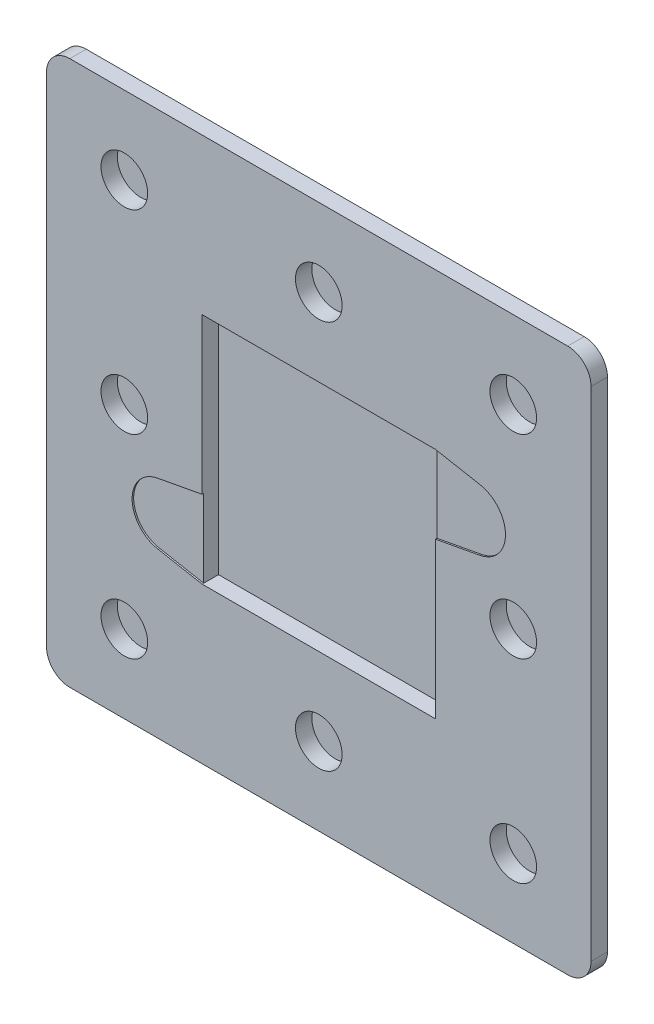
ISO-10303-21;
HEADER;
FILE_DESCRIPTION(('STEP AP214'),'2;1');
FILE_NAME('part.step','',(''),(''),'','','');
FILE_SCHEMA(('AUTOMOTIVE_DESIGN { 1 0 10303 214 1 1 1 1 }'));
ENDSEC;
DATA;
#1=APPLICATION_CONTEXT('core data for automotive mechanical design processes');
#2=APPLICATION_PROTOCOL_DEFINITION('international standard','automotive_design',2000,#1);
#3=PRODUCT_CONTEXT('',#1,'mechanical');
#4=PRODUCT('Part','Part','',(#3));
#5=PRODUCT_RELATED_PRODUCT_CATEGORY('part','',(#4));
#6=PRODUCT_DEFINITION_FORMATION('','',#4);
#7=PRODUCT_DEFINITION_CONTEXT('part definition',#1,'design');
#8=PRODUCT_DEFINITION('design','',#6,#7);
#9=PRODUCT_DEFINITION_SHAPE('','',#8);
#10=(LENGTH_UNIT() NAMED_UNIT(*) SI_UNIT(.MILLI.,.METRE.));
#11=(NAMED_UNIT(*) PLANE_ANGLE_UNIT() SI_UNIT($,.RADIAN.));
#12=(NAMED_UNIT(*) SI_UNIT($,.STERADIAN.) SOLID_ANGLE_UNIT());
#13=UNCERTAINTY_MEASURE_WITH_UNIT(LENGTH_MEASURE(1.E-05),#10,'distance_accuracy_value','');
#14=(GEOMETRIC_REPRESENTATION_CONTEXT(3) GLOBAL_UNCERTAINTY_ASSIGNED_CONTEXT((#13)) GLOBAL_UNIT_ASSIGNED_CONTEXT((#10,
#11,#12)) REPRESENTATION_CONTEXT('',''));
#15=CARTESIAN_POINT('',(0.,0.,0.));
#16=DIRECTION('',(0.,0.,1.));
#17=DIRECTION('',(1.,0.,0.));
#18=AXIS2_PLACEMENT_3D('',#15,#16,#17);
#19=CARTESIAN_POINT('',(35.,-35.,2.11));
#20=DIRECTION('',(-1.,0.,0.));
#21=DIRECTION('',(0.,0.,1.));
#22=AXIS2_PLACEMENT_3D('',#19,#20,#21);
#23=PLANE('',#22);
#24=DIRECTION('',(0.,1.,0.));
#25=VECTOR('',#24,1.);
#26=CARTESIAN_POINT('',(35.,-35.,0.));
#27=LINE('',#26,#25);
#28=CARTESIAN_POINT('',(35.,-32.,0.));
#29=VERTEX_POINT('',#28);
#30=CARTESIAN_POINT('',(35.,32.,0.));
#31=VERTEX_POINT('',#30);
#32=EDGE_CURVE('E305',#29,#31,#27,.T.);
#33=ORIENTED_EDGE('',*,*,#32,.T.);
#34=DIRECTION('',(0.,0.,-1.));
#35=VECTOR('',#34,1.);
#36=CARTESIAN_POINT('',(35.,32.,2.11));
#37=LINE('',#36,#35);
#38=CARTESIAN_POINT('',(35.,32.,2.11));
#39=VERTEX_POINT('',#38);
#40=EDGE_CURVE('E11',#31,#39,#37,.F.);
#41=ORIENTED_EDGE('',*,*,#40,.T.);
#42=DIRECTION('',(0.,1.,0.));
#43=VECTOR('',#42,1.);
#44=CARTESIAN_POINT('',(35.,-35.,2.11));
#45=LINE('',#44,#43);
#46=CARTESIAN_POINT('',(35.,-32.,2.11));
#47=VERTEX_POINT('',#46);
#48=EDGE_CURVE('E308',#47,#39,#45,.T.);
#49=ORIENTED_EDGE('',*,*,#48,.F.);
#50=DIRECTION('',(0.,0.,-1.));
#51=VECTOR('',#50,1.);
#52=CARTESIAN_POINT('',(35.,-32.,2.11));
#53=LINE('',#52,#51);
#54=EDGE_CURVE('E41',#47,#29,#53,.T.);
#55=ORIENTED_EDGE('',*,*,#54,.T.);
#56=EDGE_LOOP('',(#33,#41,#49,#55));
#57=FACE_BOUND('',#56,.T.);
#58=ADVANCED_FACE('F33',(#57),#23,.F.);
#59=CARTESIAN_POINT('',(-35.,35.,2.11));
#60=DIRECTION('',(0.,-1.,0.));
#61=DIRECTION('',(0.,0.,-1.));
#62=AXIS2_PLACEMENT_3D('',#59,#60,#61);
#63=PLANE('',#62);
#64=DIRECTION('',(-1.,0.,0.));
#65=VECTOR('',#64,1.);
#66=CARTESIAN_POINT('',(-35.,35.,0.));
#67=LINE('',#66,#65);
#68=CARTESIAN_POINT('',(32.,35.,0.));
#69=VERTEX_POINT('',#68);
#70=CARTESIAN_POINT('',(-32.,35.,0.));
#71=VERTEX_POINT('',#70);
#72=EDGE_CURVE('E322',#69,#71,#67,.T.);
#73=ORIENTED_EDGE('',*,*,#72,.T.);
#74=DIRECTION('',(0.,0.,-1.));
#75=VECTOR('',#74,1.);
#76=CARTESIAN_POINT('',(-32.,35.,2.11));
#77=LINE('',#76,#75);
#78=CARTESIAN_POINT('',(-32.,35.,2.11));
#79=VERTEX_POINT('',#78);
#80=EDGE_CURVE('E48',#71,#79,#77,.F.);
#81=ORIENTED_EDGE('',*,*,#80,.T.);
#82=DIRECTION('',(-1.,0.,0.));
#83=VECTOR('',#82,1.);
#84=CARTESIAN_POINT('',(-35.,35.,2.11));
#85=LINE('',#84,#83);
#86=CARTESIAN_POINT('',(32.,35.,2.11));
#87=VERTEX_POINT('',#86);
#88=EDGE_CURVE('E310',#87,#79,#85,.T.);
#89=ORIENTED_EDGE('',*,*,#88,.F.);
#90=DIRECTION('',(0.,0.,-1.));
#91=VECTOR('',#90,1.);
#92=CARTESIAN_POINT('',(32.,35.,2.11));
#93=LINE('',#92,#91);
#94=EDGE_CURVE('E353',#87,#69,#93,.T.);
#95=ORIENTED_EDGE('',*,*,#94,.T.);
#96=EDGE_LOOP('',(#73,#81,#89,#95));
#97=FACE_BOUND('',#96,.T.);
#98=ADVANCED_FACE('F371',(#97),#63,.F.);
#99=CARTESIAN_POINT('',(-35.,-35.,2.11));
#100=DIRECTION('',(1.,0.,0.));
#101=DIRECTION('',(0.,0.,-1.));
#102=AXIS2_PLACEMENT_3D('',#99,#100,#101);
#103=PLANE('',#102);
#104=DIRECTION('',(0.,-1.,0.));
#105=VECTOR('',#104,1.);
#106=CARTESIAN_POINT('',(-35.,-35.,0.));
#107=LINE('',#106,#105);
#108=CARTESIAN_POINT('',(-35.,32.,0.));
#109=VERTEX_POINT('',#108);
#110=CARTESIAN_POINT('',(-35.,-32.,0.));
#111=VERTEX_POINT('',#110);
#112=EDGE_CURVE('E324',#109,#111,#107,.T.);
#113=ORIENTED_EDGE('',*,*,#112,.T.);
#114=DIRECTION('',(0.,0.,-1.));
#115=VECTOR('',#114,1.);
#116=CARTESIAN_POINT('',(-35.,-32.,2.11));
#117=LINE('',#116,#115);
#118=CARTESIAN_POINT('',(-35.,-32.,2.11));
#119=VERTEX_POINT('',#118);
#120=EDGE_CURVE('E344',#111,#119,#117,.F.);
#121=ORIENTED_EDGE('',*,*,#120,.T.);
#122=DIRECTION('',(0.,-1.,0.));
#123=VECTOR('',#122,1.);
#124=CARTESIAN_POINT('',(-35.,-35.,2.11));
#125=LINE('',#124,#123);
#126=CARTESIAN_POINT('',(-35.,32.,2.11));
#127=VERTEX_POINT('',#126);
#128=EDGE_CURVE('E313',#127,#119,#125,.T.);
#129=ORIENTED_EDGE('',*,*,#128,.F.);
#130=DIRECTION('',(0.,0.,-1.));
#131=VECTOR('',#130,1.);
#132=CARTESIAN_POINT('',(-35.,32.,2.11));
#133=LINE('',#132,#131);
#134=EDGE_CURVE('E341',#127,#109,#133,.T.);
#135=ORIENTED_EDGE('',*,*,#134,.T.);
#136=EDGE_LOOP('',(#113,#121,#129,#135));
#137=FACE_BOUND('',#136,.T.);
#138=ADVANCED_FACE('F380',(#137),#103,.F.);
#139=CARTESIAN_POINT('',(-35.,-35.,2.11));
#140=DIRECTION('',(0.,1.,0.));
#141=DIRECTION('',(0.,0.,1.));
#142=AXIS2_PLACEMENT_3D('',#139,#140,#141);
#143=PLANE('',#142);
#144=DIRECTION('',(1.,0.,0.));
#145=VECTOR('',#144,1.);
#146=CARTESIAN_POINT('',(-35.,-35.,2.11));
#147=LINE('',#146,#145);
#148=CARTESIAN_POINT('',(-32.,-35.,2.11));
#149=VERTEX_POINT('',#148);
#150=CARTESIAN_POINT('',(32.,-35.,2.11));
#151=VERTEX_POINT('',#150);
#152=EDGE_CURVE('E316',#149,#151,#147,.T.);
#153=ORIENTED_EDGE('',*,*,#152,.F.);
#154=DIRECTION('',(0.,0.,-1.));
#155=VECTOR('',#154,1.);
#156=CARTESIAN_POINT('',(-32.,-35.,2.11));
#157=LINE('',#156,#155);
#158=CARTESIAN_POINT('',(-32.,-35.,0.));
#159=VERTEX_POINT('',#158);
#160=EDGE_CURVE('E330',#149,#159,#157,.T.);
#161=ORIENTED_EDGE('',*,*,#160,.T.);
#162=DIRECTION('',(1.,0.,0.));
#163=VECTOR('',#162,1.);
#164=CARTESIAN_POINT('',(-35.,-35.,0.));
#165=LINE('',#164,#163);
#166=CARTESIAN_POINT('',(32.,-35.,0.));
#167=VERTEX_POINT('',#166);
#168=EDGE_CURVE('E311',#159,#167,#165,.T.);
#169=ORIENTED_EDGE('',*,*,#168,.T.);
#170=DIRECTION('',(0.,0.,-1.));
#171=VECTOR('',#170,1.);
#172=CARTESIAN_POINT('',(32.,-35.,2.11));
#173=LINE('',#172,#171);
#174=EDGE_CURVE('E319',#167,#151,#173,.F.);
#175=ORIENTED_EDGE('',*,*,#174,.T.);
#176=EDGE_LOOP('',(#153,#161,#169,#175));
#177=FACE_BOUND('',#176,.T.);
#178=ADVANCED_FACE('F388',(#177),#143,.F.);
#179=CARTESIAN_POINT('',(0.,0.,2.11));
#180=DIRECTION('',(0.,0.,-1.));
#181=DIRECTION('',(-1.,0.,0.));
#182=AXIS2_PLACEMENT_3D('',#179,#180,#181);
#183=PLANE('',#182);
#184=CARTESIAN_POINT('',(25.,25.,2.11));
#185=DIRECTION('',(0.,0.,1.));
#186=DIRECTION('',(1.,0.,0.));
#187=AXIS2_PLACEMENT_3D('',#184,#185,#186);
#188=CIRCLE('',#187,3.);
#189=CARTESIAN_POINT('',(28.,25.,2.11));
#190=VERTEX_POINT('',#189);
#191=EDGE_CURVE('E282',#190,#190,#188,.T.);
#192=ORIENTED_EDGE('',*,*,#191,.F.);
#193=EDGE_LOOP('',(#192));
#194=FACE_BOUND('',#193,.T.);
#195=CARTESIAN_POINT('',(25.,0.,2.11));
#196=DIRECTION('',(0.,0.,1.));
#197=DIRECTION('',(1.,0.,0.));
#198=AXIS2_PLACEMENT_3D('',#195,#196,#197);
#199=CIRCLE('',#198,3.);
#200=CARTESIAN_POINT('',(28.,0.,2.11));
#201=VERTEX_POINT('',#200);
#202=EDGE_CURVE('E288',#201,#201,#199,.T.);
#203=ORIENTED_EDGE('',*,*,#202,.F.);
#204=EDGE_LOOP('',(#203));
#205=FACE_BOUND('',#204,.T.);
#206=CARTESIAN_POINT('',(25.,-25.,2.11));
#207=DIRECTION('',(0.,0.,1.));
#208=DIRECTION('',(1.,0.,0.));
#209=AXIS2_PLACEMENT_3D('',#206,#207,#208);
#210=CIRCLE('',#209,3.);
#211=CARTESIAN_POINT('',(28.,-25.,2.11));
#212=VERTEX_POINT('',#211);
#213=EDGE_CURVE('E294',#212,#212,#210,.T.);
#214=ORIENTED_EDGE('',*,*,#213,.F.);
#215=EDGE_LOOP('',(#214));
#216=FACE_BOUND('',#215,.T.);
#217=CARTESIAN_POINT('',(0.,-25.,2.11));
#218=DIRECTION('',(0.,0.,1.));
#219=DIRECTION('',(1.,0.,0.));
#220=AXIS2_PLACEMENT_3D('',#217,#218,#219);
#221=CIRCLE('',#220,3.);
#222=CARTESIAN_POINT('',(3.,-25.,2.11));
#223=VERTEX_POINT('',#222);
#224=EDGE_CURVE('E269',#223,#223,#221,.T.);
#225=ORIENTED_EDGE('',*,*,#224,.F.);
#226=EDGE_LOOP('',(#225));
#227=FACE_BOUND('',#226,.T.);
#228=DIRECTION('',(1.,0.,0.));
#229=VECTOR('',#228,1.);
#230=CARTESIAN_POINT('',(-15.,-15.,2.11));
#231=LINE('',#230,#229);
#232=CARTESIAN_POINT('',(-15.,-15.,2.11));
#233=VERTEX_POINT('',#232);
#234=CARTESIAN_POINT('',(15.,-15.,2.11));
#235=VERTEX_POINT('',#234);
#236=EDGE_CURVE('E239',#233,#235,#231,.T.);
#237=ORIENTED_EDGE('',*,*,#236,.F.);
#238=DIRECTION('',(0.98309518948453,-0.18309518948453,0.));
#239=VECTOR('',#238,1.);
#240=CARTESIAN_POINT('',(-15.,-15.,2.11));
#241=LINE('',#240,#239);
#242=CARTESIAN_POINT('',(-20.7323807579381,-13.9323807579381,2.11));
#243=VERTEX_POINT('',#242);
#244=EDGE_CURVE('E185',#243,#233,#241,.T.);
#245=ORIENTED_EDGE('',*,*,#244,.F.);
#246=CARTESIAN_POINT('',(-20.,-10.,2.11));
#247=DIRECTION('',(0.,0.,1.));
#248=DIRECTION('',(1.,0.,0.));
#249=AXIS2_PLACEMENT_3D('',#246,#247,#248);
#250=CIRCLE('',#249,4.);
#251=CARTESIAN_POINT('',(-20.7323807579381,-6.06761924206188,2.11));
#252=VERTEX_POINT('',#251);
#253=EDGE_CURVE('E784',#252,#243,#250,.T.);
#254=ORIENTED_EDGE('',*,*,#253,.F.);
#255=DIRECTION('',(-0.98309518948453,-0.18309518948453,0.));
#256=VECTOR('',#255,1.);
#257=CARTESIAN_POINT('',(-15.,-5.,2.11));
#258=LINE('',#257,#256);
#259=CARTESIAN_POINT('',(-15.,-5.,2.11));
#260=VERTEX_POINT('',#259);
#261=EDGE_CURVE('E220',#260,#252,#258,.T.);
#262=ORIENTED_EDGE('',*,*,#261,.F.);
#263=DIRECTION('',(0.,-1.,0.));
#264=VECTOR('',#263,1.);
#265=CARTESIAN_POINT('',(-15.,-15.,2.11));
#266=LINE('',#265,#264);
#267=CARTESIAN_POINT('',(-15.,15.,2.11));
#268=VERTEX_POINT('',#267);
#269=EDGE_CURVE('E190',#268,#260,#266,.T.);
#270=ORIENTED_EDGE('',*,*,#269,.F.);
#271=DIRECTION('',(-1.,0.,0.));
#272=VECTOR('',#271,1.);
#273=CARTESIAN_POINT('',(-15.,15.,2.11));
#274=LINE('',#273,#272);
#275=CARTESIAN_POINT('',(15.,15.,2.11));
#276=VERTEX_POINT('',#275);
#277=EDGE_CURVE('E252',#276,#268,#274,.T.);
#278=ORIENTED_EDGE('',*,*,#277,.F.);
#279=DIRECTION('',(-0.98309518948453,0.18309518948453,0.));
#280=VECTOR('',#279,1.);
#281=CARTESIAN_POINT('',(15.,15.,2.11));
#282=LINE('',#281,#280);
#283=CARTESIAN_POINT('',(20.7323807579381,13.9323807579381,2.11));
#284=VERTEX_POINT('',#283);
#285=EDGE_CURVE('E211',#284,#276,#282,.T.);
#286=ORIENTED_EDGE('',*,*,#285,.F.);
#287=CARTESIAN_POINT('',(20.,10.,2.11));
#288=DIRECTION('',(0.,0.,1.));
#289=DIRECTION('',(1.,0.,0.));
#290=AXIS2_PLACEMENT_3D('',#287,#288,#289);
#291=CIRCLE('',#290,4.);
#292=CARTESIAN_POINT('',(20.7323807579381,6.06761924206188,2.11));
#293=VERTEX_POINT('',#292);
#294=EDGE_CURVE('E201',#293,#284,#291,.T.);
#295=ORIENTED_EDGE('',*,*,#294,.F.);
#296=DIRECTION('',(0.98309518948453,0.18309518948453,0.));
#297=VECTOR('',#296,1.);
#298=CARTESIAN_POINT('',(15.,5.,2.11));
#299=LINE('',#298,#297);
#300=CARTESIAN_POINT('',(15.,5.,2.11));
#301=VERTEX_POINT('',#300);
#302=EDGE_CURVE('E213',#301,#293,#299,.T.);
#303=ORIENTED_EDGE('',*,*,#302,.F.);
#304=DIRECTION('',(0.,1.,0.));
#305=VECTOR('',#304,1.);
#306=CARTESIAN_POINT('',(15.,-15.,2.11));
#307=LINE('',#306,#305);
#308=EDGE_CURVE('E249',#235,#301,#307,.T.);
#309=ORIENTED_EDGE('',*,*,#308,.F.);
#310=EDGE_LOOP('',(#237,#245,#254,#262,#270,#278,#286,#295,#303,#309));
#311=FACE_BOUND('',#310,.T.);
#312=CARTESIAN_POINT('',(-25.,25.,2.11));
#313=DIRECTION('',(0.,0.,1.));
#314=DIRECTION('',(1.,0.,0.));
#315=AXIS2_PLACEMENT_3D('',#312,#313,#314);
#316=CIRCLE('',#315,3.);
#317=CARTESIAN_POINT('',(-22.,25.,2.11));
#318=VERTEX_POINT('',#317);
#319=EDGE_CURVE('E231',#318,#318,#316,.T.);
#320=ORIENTED_EDGE('',*,*,#319,.F.);
#321=EDGE_LOOP('',(#320));
#322=FACE_BOUND('',#321,.T.);
#323=CARTESIAN_POINT('',(-25.,0.,2.11));
#324=DIRECTION('',(0.,0.,1.));
#325=DIRECTION('',(1.,0.,0.));
#326=AXIS2_PLACEMENT_3D('',#323,#324,#325);
#327=CIRCLE('',#326,3.);
#328=CARTESIAN_POINT('',(-22.,0.,2.11));
#329=VERTEX_POINT('',#328);
#330=EDGE_CURVE('E230',#329,#329,#327,.T.);
#331=ORIENTED_EDGE('',*,*,#330,.F.);
#332=EDGE_LOOP('',(#331));
#333=FACE_BOUND('',#332,.T.);
#334=CARTESIAN_POINT('',(-25.,-25.,2.11));
#335=DIRECTION('',(0.,0.,1.));
#336=DIRECTION('',(1.,0.,0.));
#337=AXIS2_PLACEMENT_3D('',#334,#335,#336);
#338=CIRCLE('',#337,3.);
#339=CARTESIAN_POINT('',(-22.,-25.,2.11));
#340=VERTEX_POINT('',#339);
#341=EDGE_CURVE('E270',#340,#340,#338,.T.);
#342=ORIENTED_EDGE('',*,*,#341,.F.);
#343=EDGE_LOOP('',(#342));
#344=FACE_BOUND('',#343,.T.);
#345=CARTESIAN_POINT('',(0.,25.,2.11));
#346=DIRECTION('',(0.,0.,1.));
#347=DIRECTION('',(1.,0.,0.));
#348=AXIS2_PLACEMENT_3D('',#345,#346,#347);
#349=CIRCLE('',#348,3.);
#350=CARTESIAN_POINT('',(3.,25.,2.11));
#351=VERTEX_POINT('',#350);
#352=EDGE_CURVE('E281',#351,#351,#349,.T.);
#353=ORIENTED_EDGE('',*,*,#352,.F.);
#354=EDGE_LOOP('',(#353));
#355=FACE_BOUND('',#354,.T.);
#356=ORIENTED_EDGE('',*,*,#128,.T.);
#357=CARTESIAN_POINT('',(-32.,-32.,2.11));
#358=DIRECTION('',(0.,0.,-1.));
#359=DIRECTION('',(-1.,0.,0.));
#360=AXIS2_PLACEMENT_3D('',#357,#358,#359);
#361=CIRCLE('',#360,3.);
#362=EDGE_CURVE('E351',#119,#149,#361,.F.);
#363=ORIENTED_EDGE('',*,*,#362,.T.);
#364=ORIENTED_EDGE('',*,*,#152,.T.);
#365=CARTESIAN_POINT('',(32.,-32.,2.11));
#366=DIRECTION('',(0.,0.,-1.));
#367=DIRECTION('',(-1.,0.,0.));
#368=AXIS2_PLACEMENT_3D('',#365,#366,#367);
#369=CIRCLE('',#368,3.);
#370=EDGE_CURVE('E346',#151,#47,#369,.F.);
#371=ORIENTED_EDGE('',*,*,#370,.T.);
#372=ORIENTED_EDGE('',*,*,#48,.T.);
#373=CARTESIAN_POINT('',(32.,32.,2.11));
#374=DIRECTION('',(0.,0.,-1.));
#375=DIRECTION('',(-1.,0.,0.));
#376=AXIS2_PLACEMENT_3D('',#373,#374,#375);
#377=CIRCLE('',#376,3.);
#378=EDGE_CURVE('E55',#39,#87,#377,.F.);
#379=ORIENTED_EDGE('',*,*,#378,.T.);
#380=ORIENTED_EDGE('',*,*,#88,.T.);
#381=CARTESIAN_POINT('',(-32.,32.,2.11));
#382=DIRECTION('',(0.,0.,-1.));
#383=DIRECTION('',(-1.,0.,0.));
#384=AXIS2_PLACEMENT_3D('',#381,#382,#383);
#385=CIRCLE('',#384,3.);
#386=EDGE_CURVE('E349',#79,#127,#385,.F.);
#387=ORIENTED_EDGE('',*,*,#386,.T.);
#388=EDGE_LOOP('',(#356,#363,#364,#371,#372,#379,#380,#387));
#389=FACE_BOUND('',#388,.T.);
#390=ADVANCED_FACE('F373',(#194,#205,#216,#227,#311,#322,#333,#344,#355,#389),#183,.F.);
#391=CARTESIAN_POINT('',(0.,0.,0.));
#392=DIRECTION('',(0.,0.,-1.));
#393=DIRECTION('',(-1.,0.,0.));
#394=AXIS2_PLACEMENT_3D('',#391,#392,#393);
#395=PLANE('',#394);
#396=ORIENTED_EDGE('',*,*,#168,.F.);
#397=CARTESIAN_POINT('',(-32.,-32.,0.));
#398=DIRECTION('',(0.,0.,-1.));
#399=DIRECTION('',(-1.,0.,0.));
#400=AXIS2_PLACEMENT_3D('',#397,#398,#399);
#401=CIRCLE('',#400,3.);
#402=EDGE_CURVE('E339',#159,#111,#401,.T.);
#403=ORIENTED_EDGE('',*,*,#402,.T.);
#404=ORIENTED_EDGE('',*,*,#112,.F.);
#405=CARTESIAN_POINT('',(-32.,32.,0.));
#406=DIRECTION('',(0.,0.,-1.));
#407=DIRECTION('',(-1.,0.,0.));
#408=AXIS2_PLACEMENT_3D('',#405,#406,#407);
#409=CIRCLE('',#408,3.);
#410=EDGE_CURVE('E337',#109,#71,#409,.T.);
#411=ORIENTED_EDGE('',*,*,#410,.T.);
#412=ORIENTED_EDGE('',*,*,#72,.F.);
#413=CARTESIAN_POINT('',(32.,32.,0.));
#414=DIRECTION('',(0.,0.,-1.));
#415=DIRECTION('',(-1.,0.,0.));
#416=AXIS2_PLACEMENT_3D('',#413,#414,#415);
#417=CIRCLE('',#416,3.);
#418=EDGE_CURVE('E335',#69,#31,#417,.T.);
#419=ORIENTED_EDGE('',*,*,#418,.T.);
#420=ORIENTED_EDGE('',*,*,#32,.F.);
#421=CARTESIAN_POINT('',(32.,-32.,0.));
#422=DIRECTION('',(0.,0.,-1.));
#423=DIRECTION('',(-1.,0.,0.));
#424=AXIS2_PLACEMENT_3D('',#421,#422,#423);
#425=CIRCLE('',#424,3.);
#426=EDGE_CURVE('E333',#29,#167,#425,.T.);
#427=ORIENTED_EDGE('',*,*,#426,.T.);
#428=EDGE_LOOP('',(#396,#403,#404,#411,#412,#419,#420,#427));
#429=FACE_BOUND('',#428,.T.);
#430=ADVANCED_FACE('F366',(#429),#395,.T.);
#431=CARTESIAN_POINT('',(0.,25.,0.0049999999999998));
#432=DIRECTION('',(0.,0.,1.));
#433=DIRECTION('',(1.,0.,0.));
#434=AXIS2_PLACEMENT_3D('',#431,#432,#433);
#435=CYLINDRICAL_SURFACE('',#434,3.);
#436=CARTESIAN_POINT('',(0.,25.,0.0049999999999998));
#437=DIRECTION('',(0.,0.,1.));
#438=DIRECTION('',(1.,0.,0.));
#439=AXIS2_PLACEMENT_3D('',#436,#437,#438);
#440=CIRCLE('',#439,3.);
#441=CARTESIAN_POINT('',(3.,25.,0.0049999999999998));
#442=VERTEX_POINT('',#441);
#443=EDGE_CURVE('E302',#442,#442,#440,.T.);
#444=ORIENTED_EDGE('',*,*,#443,.F.);
#445=EDGE_LOOP('',(#444));
#446=FACE_BOUND('',#445,.T.);
#447=ORIENTED_EDGE('',*,*,#352,.T.);
#448=EDGE_LOOP('',(#447));
#449=FACE_BOUND('',#448,.T.);
#450=ADVANCED_FACE('F672',(#446,#449),#435,.F.);
#451=CARTESIAN_POINT('',(0.,25.,0.0049999999999998));
#452=DIRECTION('',(0.,0.,1.));
#453=DIRECTION('',(1.,0.,0.));
#454=AXIS2_PLACEMENT_3D('',#451,#452,#453);
#455=PLANE('',#454);
#456=ORIENTED_EDGE('',*,*,#443,.T.);
#457=EDGE_LOOP('',(#456));
#458=FACE_BOUND('',#457,.T.);
#459=ADVANCED_FACE('F663',(#458),#455,.T.);
#460=CARTESIAN_POINT('',(-25.,-25.,0.0049999999999998));
#461=DIRECTION('',(0.,0.,1.));
#462=DIRECTION('',(1.,0.,0.));
#463=AXIS2_PLACEMENT_3D('',#460,#461,#462);
#464=CYLINDRICAL_SURFACE('',#463,3.);
#465=CARTESIAN_POINT('',(-25.,-25.,0.0049999999999998));
#466=DIRECTION('',(0.,0.,1.));
#467=DIRECTION('',(1.,0.,0.));
#468=AXIS2_PLACEMENT_3D('',#465,#466,#467);
#469=CIRCLE('',#468,3.);
#470=CARTESIAN_POINT('',(-22.,-25.,0.0049999999999998));
#471=VERTEX_POINT('',#470);
#472=EDGE_CURVE('E266',#471,#471,#469,.T.);
#473=ORIENTED_EDGE('',*,*,#472,.F.);
#474=EDGE_LOOP('',(#473));
#475=FACE_BOUND('',#474,.T.);
#476=ORIENTED_EDGE('',*,*,#341,.T.);
#477=EDGE_LOOP('',(#476));
#478=FACE_BOUND('',#477,.T.);
#479=ADVANCED_FACE('F654',(#475,#478),#464,.F.);
#480=CARTESIAN_POINT('',(-25.,-25.,0.0049999999999998));
#481=DIRECTION('',(0.,0.,1.));
#482=DIRECTION('',(1.,0.,0.));
#483=AXIS2_PLACEMENT_3D('',#480,#481,#482);
#484=PLANE('',#483);
#485=ORIENTED_EDGE('',*,*,#472,.T.);
#486=EDGE_LOOP('',(#485));
#487=FACE_BOUND('',#486,.T.);
#488=ADVANCED_FACE('F645',(#487),#484,.T.);
#489=CARTESIAN_POINT('',(-25.,0.,0.0049999999999998));
#490=DIRECTION('',(0.,0.,1.));
#491=DIRECTION('',(1.,0.,0.));
#492=AXIS2_PLACEMENT_3D('',#489,#490,#491);
#493=CYLINDRICAL_SURFACE('',#492,3.);
#494=CARTESIAN_POINT('',(-25.,0.,0.0049999999999998));
#495=DIRECTION('',(0.,0.,1.));
#496=DIRECTION('',(1.,0.,0.));
#497=AXIS2_PLACEMENT_3D('',#494,#495,#496);
#498=CIRCLE('',#497,3.);
#499=CARTESIAN_POINT('',(-22.,0.,0.0049999999999998));
#500=VERTEX_POINT('',#499);
#501=EDGE_CURVE('E273',#500,#500,#498,.T.);
#502=ORIENTED_EDGE('',*,*,#501,.F.);
#503=EDGE_LOOP('',(#502));
#504=FACE_BOUND('',#503,.T.);
#505=ORIENTED_EDGE('',*,*,#330,.T.);
#506=EDGE_LOOP('',(#505));
#507=FACE_BOUND('',#506,.T.);
#508=ADVANCED_FACE('F636',(#504,#507),#493,.F.);
#509=CARTESIAN_POINT('',(-25.,0.,0.0049999999999998));
#510=DIRECTION('',(0.,0.,1.));
#511=DIRECTION('',(1.,0.,0.));
#512=AXIS2_PLACEMENT_3D('',#509,#510,#511);
#513=PLANE('',#512);
#514=ORIENTED_EDGE('',*,*,#501,.T.);
#515=EDGE_LOOP('',(#514));
#516=FACE_BOUND('',#515,.T.);
#517=ADVANCED_FACE('F627',(#516),#513,.T.);
#518=CARTESIAN_POINT('',(-25.,25.,0.0049999999999998));
#519=DIRECTION('',(0.,0.,1.));
#520=DIRECTION('',(1.,0.,0.));
#521=AXIS2_PLACEMENT_3D('',#518,#519,#520);
#522=CYLINDRICAL_SURFACE('',#521,3.);
#523=CARTESIAN_POINT('',(-25.,25.,0.0049999999999998));
#524=DIRECTION('',(0.,0.,1.));
#525=DIRECTION('',(1.,0.,0.));
#526=AXIS2_PLACEMENT_3D('',#523,#524,#525);
#527=CIRCLE('',#526,3.);
#528=CARTESIAN_POINT('',(-22.,25.,0.0049999999999998));
#529=VERTEX_POINT('',#528);
#530=EDGE_CURVE('E227',#529,#529,#527,.T.);
#531=ORIENTED_EDGE('',*,*,#530,.F.);
#532=EDGE_LOOP('',(#531));
#533=FACE_BOUND('',#532,.T.);
#534=ORIENTED_EDGE('',*,*,#319,.T.);
#535=EDGE_LOOP('',(#534));
#536=FACE_BOUND('',#535,.T.);
#537=ADVANCED_FACE('F618',(#533,#536),#522,.F.);
#538=CARTESIAN_POINT('',(-25.,25.,0.0049999999999998));
#539=DIRECTION('',(0.,0.,1.));
#540=DIRECTION('',(1.,0.,0.));
#541=AXIS2_PLACEMENT_3D('',#538,#539,#540);
#542=PLANE('',#541);
#543=ORIENTED_EDGE('',*,*,#530,.T.);
#544=EDGE_LOOP('',(#543));
#545=FACE_BOUND('',#544,.T.);
#546=ADVANCED_FACE('F610',(#545),#542,.T.);
#547=CARTESIAN_POINT('',(15.,-15.,0.0049999999999998));
#548=DIRECTION('',(1.,0.,0.));
#549=DIRECTION('',(0.,0.,-1.));
#550=AXIS2_PLACEMENT_3D('',#547,#548,#549);
#551=PLANE('',#550);
#552=ORIENTED_EDGE('',*,*,#308,.T.);
#553=DIRECTION('',(0.,0.,1.));
#554=VECTOR('',#553,1.);
#555=CARTESIAN_POINT('',(15.,5.,1.91));
#556=LINE('',#555,#554);
#557=CARTESIAN_POINT('',(15.,5.,1.91));
#558=VERTEX_POINT('',#557);
#559=EDGE_CURVE('E223',#558,#301,#556,.T.);
#560=ORIENTED_EDGE('',*,*,#559,.F.);
#561=DIRECTION('',(0.,-1.,0.));
#562=VECTOR('',#561,1.);
#563=CARTESIAN_POINT('',(15.,5.,1.91));
#564=LINE('',#563,#562);
#565=CARTESIAN_POINT('',(15.,15.,1.91));
#566=VERTEX_POINT('',#565);
#567=EDGE_CURVE('E200',#566,#558,#564,.T.);
#568=ORIENTED_EDGE('',*,*,#567,.F.);
#569=DIRECTION('',(0.,0.,1.));
#570=VECTOR('',#569,1.);
#571=CARTESIAN_POINT('',(15.,15.,0.0049999999999998));
#572=LINE('',#571,#570);
#573=CARTESIAN_POINT('',(15.,15.,0.0049999999999998));
#574=VERTEX_POINT('',#573);
#575=EDGE_CURVE('E248',#574,#566,#572,.T.);
#576=ORIENTED_EDGE('',*,*,#575,.F.);
#577=DIRECTION('',(0.,1.,0.));
#578=VECTOR('',#577,1.);
#579=CARTESIAN_POINT('',(15.,-15.,0.0049999999999998));
#580=LINE('',#579,#578);
#581=CARTESIAN_POINT('',(15.,-15.,0.0049999999999998));
#582=VERTEX_POINT('',#581);
#583=EDGE_CURVE('E235',#582,#574,#580,.T.);
#584=ORIENTED_EDGE('',*,*,#583,.F.);
#585=DIRECTION('',(0.,0.,1.));
#586=VECTOR('',#585,1.);
#587=CARTESIAN_POINT('',(15.,-15.,0.0049999999999998));
#588=LINE('',#587,#586);
#589=EDGE_CURVE('E234',#582,#235,#588,.T.);
#590=ORIENTED_EDGE('',*,*,#589,.T.);
#591=EDGE_LOOP('',(#552,#560,#568,#576,#584,#590));
#592=FACE_BOUND('',#591,.T.);
#593=ADVANCED_FACE('F602',(#592),#551,.F.);
#594=CARTESIAN_POINT('',(-15.,-15.,0.0049999999999998));
#595=DIRECTION('',(0.,-1.,0.));
#596=DIRECTION('',(0.,0.,-1.));
#597=AXIS2_PLACEMENT_3D('',#594,#595,#596);
#598=PLANE('',#597);
#599=ORIENTED_EDGE('',*,*,#236,.T.);
#600=ORIENTED_EDGE('',*,*,#589,.F.);
#601=DIRECTION('',(1.,0.,0.));
#602=VECTOR('',#601,1.);
#603=CARTESIAN_POINT('',(-15.,-15.,0.0049999999999998));
#604=LINE('',#603,#602);
#605=CARTESIAN_POINT('',(-15.,-15.,0.0049999999999998));
#606=VERTEX_POINT('',#605);
#607=EDGE_CURVE('E245',#606,#582,#604,.T.);
#608=ORIENTED_EDGE('',*,*,#607,.F.);
#609=DIRECTION('',(0.,0.,1.));
#610=VECTOR('',#609,1.);
#611=CARTESIAN_POINT('',(-15.,-15.,0.0049999999999998));
#612=LINE('',#611,#610);
#613=CARTESIAN_POINT('',(-15.,-15.,1.91));
#614=VERTEX_POINT('',#613);
#615=EDGE_CURVE('E260',#606,#614,#612,.T.);
#616=ORIENTED_EDGE('',*,*,#615,.T.);
#617=DIRECTION('',(0.,0.,1.));
#618=VECTOR('',#617,1.);
#619=CARTESIAN_POINT('',(-15.,-15.,1.91));
#620=LINE('',#619,#618);
#621=EDGE_CURVE('E253',#614,#233,#620,.T.);
#622=ORIENTED_EDGE('',*,*,#621,.T.);
#623=EDGE_LOOP('',(#599,#600,#608,#616,#622));
#624=FACE_BOUND('',#623,.T.);
#625=ADVANCED_FACE('F594',(#624),#598,.F.);
#626=CARTESIAN_POINT('',(-15.,-15.,0.0049999999999998));
#627=DIRECTION('',(-1.,0.,0.));
#628=DIRECTION('',(0.,0.,1.));
#629=AXIS2_PLACEMENT_3D('',#626,#627,#628);
#630=PLANE('',#629);
#631=ORIENTED_EDGE('',*,*,#269,.T.);
#632=DIRECTION('',(0.,0.,1.));
#633=VECTOR('',#632,1.);
#634=CARTESIAN_POINT('',(-15.,-5.,1.91));
#635=LINE('',#634,#633);
#636=CARTESIAN_POINT('',(-15.,-5.,1.91));
#637=VERTEX_POINT('',#636);
#638=EDGE_CURVE('E169',#637,#260,#635,.T.);
#639=ORIENTED_EDGE('',*,*,#638,.F.);
#640=DIRECTION('',(0.,1.,0.));
#641=VECTOR('',#640,1.);
#642=CARTESIAN_POINT('',(-15.,-15.,1.91));
#643=LINE('',#642,#641);
#644=EDGE_CURVE('E176',#614,#637,#643,.T.);
#645=ORIENTED_EDGE('',*,*,#644,.F.);
#646=ORIENTED_EDGE('',*,*,#615,.F.);
#647=DIRECTION('',(0.,-1.,0.));
#648=VECTOR('',#647,1.);
#649=CARTESIAN_POINT('',(-15.,-15.,0.0049999999999998));
#650=LINE('',#649,#648);
#651=CARTESIAN_POINT('',(-15.,15.,0.0049999999999998));
#652=VERTEX_POINT('',#651);
#653=EDGE_CURVE('E242',#652,#606,#650,.T.);
#654=ORIENTED_EDGE('',*,*,#653,.F.);
#655=DIRECTION('',(0.,0.,1.));
#656=VECTOR('',#655,1.);
#657=CARTESIAN_POINT('',(-15.,15.,0.0049999999999998));
#658=LINE('',#657,#656);
#659=EDGE_CURVE('E262',#652,#268,#658,.T.);
#660=ORIENTED_EDGE('',*,*,#659,.T.);
#661=EDGE_LOOP('',(#631,#639,#645,#646,#654,#660));
#662=FACE_BOUND('',#661,.T.);
#663=ADVANCED_FACE('F188',(#662),#630,.F.);
#664=CARTESIAN_POINT('',(-15.,15.,0.0049999999999998));
#665=DIRECTION('',(0.,1.,0.));
#666=DIRECTION('',(0.,0.,1.));
#667=AXIS2_PLACEMENT_3D('',#664,#665,#666);
#668=PLANE('',#667);
#669=ORIENTED_EDGE('',*,*,#277,.T.);
#670=ORIENTED_EDGE('',*,*,#659,.F.);
#671=DIRECTION('',(-1.,0.,0.));
#672=VECTOR('',#671,1.);
#673=CARTESIAN_POINT('',(-15.,15.,0.0049999999999998));
#674=LINE('',#673,#672);
#675=EDGE_CURVE('E238',#574,#652,#674,.T.);
#676=ORIENTED_EDGE('',*,*,#675,.F.);
#677=ORIENTED_EDGE('',*,*,#575,.T.);
#678=DIRECTION('',(0.,0.,1.));
#679=VECTOR('',#678,1.);
#680=CARTESIAN_POINT('',(15.,15.,1.91));
#681=LINE('',#680,#679);
#682=EDGE_CURVE('E210',#566,#276,#681,.T.);
#683=ORIENTED_EDGE('',*,*,#682,.T.);
#684=EDGE_LOOP('',(#669,#670,#676,#677,#683));
#685=FACE_BOUND('',#684,.T.);
#686=ADVANCED_FACE('F577',(#685),#668,.F.);
#687=CARTESIAN_POINT('',(0.,0.,0.0049999999999998));
#688=DIRECTION('',(0.,0.,-1.));
#689=DIRECTION('',(-1.,0.,0.));
#690=AXIS2_PLACEMENT_3D('',#687,#688,#689);
#691=PLANE('',#690);
#692=ORIENTED_EDGE('',*,*,#583,.T.);
#693=ORIENTED_EDGE('',*,*,#675,.T.);
#694=ORIENTED_EDGE('',*,*,#653,.T.);
#695=ORIENTED_EDGE('',*,*,#607,.T.);
#696=EDGE_LOOP('',(#692,#693,#694,#695));
#697=FACE_BOUND('',#696,.T.);
#698=ADVANCED_FACE('F568',(#697),#691,.F.);
#699=CARTESIAN_POINT('',(0.,-25.,0.0049999999999998));
#700=DIRECTION('',(0.,0.,1.));
#701=DIRECTION('',(1.,0.,0.));
#702=AXIS2_PLACEMENT_3D('',#699,#700,#701);
#703=CYLINDRICAL_SURFACE('',#702,3.);
#704=CARTESIAN_POINT('',(0.,-25.,0.0049999999999998));
#705=DIRECTION('',(0.,0.,1.));
#706=DIRECTION('',(1.,0.,0.));
#707=AXIS2_PLACEMENT_3D('',#704,#705,#706);
#708=CIRCLE('',#707,3.);
#709=CARTESIAN_POINT('',(3.,-25.,0.0049999999999998));
#710=VERTEX_POINT('',#709);
#711=EDGE_CURVE('E297',#710,#710,#708,.T.);
#712=ORIENTED_EDGE('',*,*,#711,.F.);
#713=EDGE_LOOP('',(#712));
#714=FACE_BOUND('',#713,.T.);
#715=ORIENTED_EDGE('',*,*,#224,.T.);
#716=EDGE_LOOP('',(#715));
#717=FACE_BOUND('',#716,.T.);
#718=ADVANCED_FACE('F559',(#714,#717),#703,.F.);
#719=CARTESIAN_POINT('',(0.,-25.,0.0049999999999998));
#720=DIRECTION('',(0.,0.,1.));
#721=DIRECTION('',(1.,0.,0.));
#722=AXIS2_PLACEMENT_3D('',#719,#720,#721);
#723=PLANE('',#722);
#724=ORIENTED_EDGE('',*,*,#711,.T.);
#725=EDGE_LOOP('',(#724));
#726=FACE_BOUND('',#725,.T.);
#727=ADVANCED_FACE('F550',(#726),#723,.T.);
#728=CARTESIAN_POINT('',(25.,-25.,0.0049999999999998));
#729=DIRECTION('',(0.,0.,1.));
#730=DIRECTION('',(1.,0.,0.));
#731=AXIS2_PLACEMENT_3D('',#728,#729,#730);
#732=CYLINDRICAL_SURFACE('',#731,3.);
#733=CARTESIAN_POINT('',(25.,-25.,0.0049999999999998));
#734=DIRECTION('',(0.,0.,1.));
#735=DIRECTION('',(1.,0.,0.));
#736=AXIS2_PLACEMENT_3D('',#733,#734,#735);
#737=CIRCLE('',#736,3.);
#738=CARTESIAN_POINT('',(28.,-25.,0.0049999999999998));
#739=VERTEX_POINT('',#738);
#740=EDGE_CURVE('E291',#739,#739,#737,.T.);
#741=ORIENTED_EDGE('',*,*,#740,.F.);
#742=EDGE_LOOP('',(#741));
#743=FACE_BOUND('',#742,.T.);
#744=ORIENTED_EDGE('',*,*,#213,.T.);
#745=EDGE_LOOP('',(#744));
#746=FACE_BOUND('',#745,.T.);
#747=ADVANCED_FACE('F541',(#743,#746),#732,.F.);
#748=CARTESIAN_POINT('',(25.,-25.,0.0049999999999998));
#749=DIRECTION('',(0.,0.,1.));
#750=DIRECTION('',(1.,0.,0.));
#751=AXIS2_PLACEMENT_3D('',#748,#749,#750);
#752=PLANE('',#751);
#753=ORIENTED_EDGE('',*,*,#740,.T.);
#754=EDGE_LOOP('',(#753));
#755=FACE_BOUND('',#754,.T.);
#756=ADVANCED_FACE('F532',(#755),#752,.T.);
#757=CARTESIAN_POINT('',(25.,0.,0.0049999999999998));
#758=DIRECTION('',(0.,0.,1.));
#759=DIRECTION('',(1.,0.,0.));
#760=AXIS2_PLACEMENT_3D('',#757,#758,#759);
#761=CYLINDRICAL_SURFACE('',#760,3.);
#762=CARTESIAN_POINT('',(25.,0.,0.0049999999999998));
#763=DIRECTION('',(0.,0.,1.));
#764=DIRECTION('',(1.,0.,0.));
#765=AXIS2_PLACEMENT_3D('',#762,#763,#764);
#766=CIRCLE('',#765,3.);
#767=CARTESIAN_POINT('',(28.,0.,0.0049999999999998));
#768=VERTEX_POINT('',#767);
#769=EDGE_CURVE('E285',#768,#768,#766,.T.);
#770=ORIENTED_EDGE('',*,*,#769,.F.);
#771=EDGE_LOOP('',(#770));
#772=FACE_BOUND('',#771,.T.);
#773=ORIENTED_EDGE('',*,*,#202,.T.);
#774=EDGE_LOOP('',(#773));
#775=FACE_BOUND('',#774,.T.);
#776=ADVANCED_FACE('F523',(#772,#775),#761,.F.);
#777=CARTESIAN_POINT('',(25.,0.,0.0049999999999998));
#778=DIRECTION('',(0.,0.,1.));
#779=DIRECTION('',(1.,0.,0.));
#780=AXIS2_PLACEMENT_3D('',#777,#778,#779);
#781=PLANE('',#780);
#782=ORIENTED_EDGE('',*,*,#769,.T.);
#783=EDGE_LOOP('',(#782));
#784=FACE_BOUND('',#783,.T.);
#785=ADVANCED_FACE('F514',(#784),#781,.T.);
#786=CARTESIAN_POINT('',(25.,25.,0.0049999999999998));
#787=DIRECTION('',(0.,0.,1.));
#788=DIRECTION('',(1.,0.,0.));
#789=AXIS2_PLACEMENT_3D('',#786,#787,#788);
#790=CYLINDRICAL_SURFACE('',#789,3.);
#791=CARTESIAN_POINT('',(25.,25.,0.0049999999999998));
#792=DIRECTION('',(0.,0.,1.));
#793=DIRECTION('',(1.,0.,0.));
#794=AXIS2_PLACEMENT_3D('',#791,#792,#793);
#795=CIRCLE('',#794,3.);
#796=CARTESIAN_POINT('',(28.,25.,0.0049999999999998));
#797=VERTEX_POINT('',#796);
#798=EDGE_CURVE('E278',#797,#797,#795,.T.);
#799=ORIENTED_EDGE('',*,*,#798,.F.);
#800=EDGE_LOOP('',(#799));
#801=FACE_BOUND('',#800,.T.);
#802=ORIENTED_EDGE('',*,*,#191,.T.);
#803=EDGE_LOOP('',(#802));
#804=FACE_BOUND('',#803,.T.);
#805=ADVANCED_FACE('F504',(#801,#804),#790,.F.);
#806=CARTESIAN_POINT('',(25.,25.,0.0049999999999998));
#807=DIRECTION('',(0.,0.,1.));
#808=DIRECTION('',(1.,0.,0.));
#809=AXIS2_PLACEMENT_3D('',#806,#807,#808);
#810=PLANE('',#809);
#811=ORIENTED_EDGE('',*,*,#798,.T.);
#812=EDGE_LOOP('',(#811));
#813=FACE_BOUND('',#812,.T.);
#814=ADVANCED_FACE('F494',(#813),#810,.T.);
#815=CARTESIAN_POINT('',(15.,15.,1.91));
#816=DIRECTION('',(0.18309518948453,0.98309518948453,0.));
#817=DIRECTION('',(-0.98309518948453,0.18309518948453,0.));
#818=AXIS2_PLACEMENT_3D('',#815,#816,#817);
#819=PLANE('',#818);
#820=ORIENTED_EDGE('',*,*,#285,.T.);
#821=ORIENTED_EDGE('',*,*,#682,.F.);
#822=DIRECTION('',(-0.98309518948453,0.18309518948453,0.));
#823=VECTOR('',#822,1.);
#824=CARTESIAN_POINT('',(15.,15.,1.91));
#825=LINE('',#824,#823);
#826=CARTESIAN_POINT('',(20.7323807579381,13.9323807579381,1.91));
#827=VERTEX_POINT('',#826);
#828=EDGE_CURVE('E197',#827,#566,#825,.T.);
#829=ORIENTED_EDGE('',*,*,#828,.F.);
#830=DIRECTION('',(0.,0.,1.));
#831=VECTOR('',#830,1.);
#832=CARTESIAN_POINT('',(20.7323807579381,13.9323807579381,1.91));
#833=LINE('',#832,#831);
#834=EDGE_CURVE('E218',#827,#284,#833,.T.);
#835=ORIENTED_EDGE('',*,*,#834,.T.);
#836=EDGE_LOOP('',(#820,#821,#829,#835));
#837=FACE_BOUND('',#836,.T.);
#838=ADVANCED_FACE('F485',(#837),#819,.F.);
#839=CARTESIAN_POINT('',(20.,10.,1.91));
#840=DIRECTION('',(0.,0.,1.));
#841=DIRECTION('',(1.,0.,0.));
#842=AXIS2_PLACEMENT_3D('',#839,#840,#841);
#843=CYLINDRICAL_SURFACE('',#842,4.);
#844=ORIENTED_EDGE('',*,*,#294,.T.);
#845=ORIENTED_EDGE('',*,*,#834,.F.);
#846=CARTESIAN_POINT('',(20.,10.,1.91));
#847=DIRECTION('',(0.,0.,1.));
#848=DIRECTION('',(1.,0.,0.));
#849=AXIS2_PLACEMENT_3D('',#846,#847,#848);
#850=CIRCLE('',#849,4.);
#851=CARTESIAN_POINT('',(20.7323807579381,6.06761924206188,1.91));
#852=VERTEX_POINT('',#851);
#853=EDGE_CURVE('E207',#852,#827,#850,.T.);
#854=ORIENTED_EDGE('',*,*,#853,.F.);
#855=DIRECTION('',(0.,0.,1.));
#856=VECTOR('',#855,1.);
#857=CARTESIAN_POINT('',(20.7323807579381,6.06761924206188,1.91));
#858=LINE('',#857,#856);
#859=EDGE_CURVE('E221',#852,#293,#858,.T.);
#860=ORIENTED_EDGE('',*,*,#859,.T.);
#861=EDGE_LOOP('',(#844,#845,#854,#860));
#862=FACE_BOUND('',#861,.T.);
#863=ADVANCED_FACE('F476',(#862),#843,.F.);
#864=CARTESIAN_POINT('',(15.,5.,1.91));
#865=DIRECTION('',(0.18309518948453,-0.98309518948453,0.));
#866=DIRECTION('',(0.98309518948453,0.18309518948453,0.));
#867=AXIS2_PLACEMENT_3D('',#864,#865,#866);
#868=PLANE('',#867);
#869=ORIENTED_EDGE('',*,*,#302,.T.);
#870=ORIENTED_EDGE('',*,*,#859,.F.);
#871=DIRECTION('',(0.98309518948453,0.18309518948453,0.));
#872=VECTOR('',#871,1.);
#873=CARTESIAN_POINT('',(15.,5.,1.91));
#874=LINE('',#873,#872);
#875=EDGE_CURVE('E204',#558,#852,#874,.T.);
#876=ORIENTED_EDGE('',*,*,#875,.F.);
#877=ORIENTED_EDGE('',*,*,#559,.T.);
#878=EDGE_LOOP('',(#869,#870,#876,#877));
#879=FACE_BOUND('',#878,.T.);
#880=ADVANCED_FACE('F467',(#879),#868,.F.);
#881=CARTESIAN_POINT('',(20.,10.,1.91));
#882=DIRECTION('',(0.,0.,1.));
#883=DIRECTION('',(1.,0.,0.));
#884=AXIS2_PLACEMENT_3D('',#881,#882,#883);
#885=PLANE('',#884);
#886=ORIENTED_EDGE('',*,*,#828,.T.);
#887=ORIENTED_EDGE('',*,*,#567,.T.);
#888=ORIENTED_EDGE('',*,*,#875,.T.);
#889=ORIENTED_EDGE('',*,*,#853,.T.);
#890=EDGE_LOOP('',(#886,#887,#888,#889));
#891=FACE_BOUND('',#890,.T.);
#892=ADVANCED_FACE('F458',(#891),#885,.T.);
#893=CARTESIAN_POINT('',(-15.,-15.,1.91));
#894=DIRECTION('',(-0.18309518948453,-0.98309518948453,0.));
#895=DIRECTION('',(0.98309518948453,-0.18309518948453,0.));
#896=AXIS2_PLACEMENT_3D('',#893,#894,#895);
#897=PLANE('',#896);
#898=ORIENTED_EDGE('',*,*,#244,.T.);
#899=ORIENTED_EDGE('',*,*,#621,.F.);
#900=DIRECTION('',(0.98309518948453,-0.18309518948453,0.));
#901=VECTOR('',#900,1.);
#902=CARTESIAN_POINT('',(-15.,-15.,1.91));
#903=LINE('',#902,#901);
#904=CARTESIAN_POINT('',(-20.7323807579381,-13.9323807579381,1.91));
#905=VERTEX_POINT('',#904);
#906=EDGE_CURVE('E181',#905,#614,#903,.T.);
#907=ORIENTED_EDGE('',*,*,#906,.F.);
#908=DIRECTION('',(0.,0.,1.));
#909=VECTOR('',#908,1.);
#910=CARTESIAN_POINT('',(-20.7323807579381,-13.9323807579381,1.91));
#911=LINE('',#910,#909);
#912=EDGE_CURVE('E192',#905,#243,#911,.T.);
#913=ORIENTED_EDGE('',*,*,#912,.T.);
#914=EDGE_LOOP('',(#898,#899,#907,#913));
#915=FACE_BOUND('',#914,.T.);
#916=ADVANCED_FACE('F449',(#915),#897,.F.);
#917=CARTESIAN_POINT('',(-20.,-10.,1.91));
#918=DIRECTION('',(0.,0.,1.));
#919=DIRECTION('',(1.,0.,0.));
#920=AXIS2_PLACEMENT_3D('',#917,#918,#919);
#921=CYLINDRICAL_SURFACE('',#920,4.);
#922=ORIENTED_EDGE('',*,*,#253,.T.);
#923=ORIENTED_EDGE('',*,*,#912,.F.);
#924=CARTESIAN_POINT('',(-20.,-10.,1.91));
#925=DIRECTION('',(0.,0.,1.));
#926=DIRECTION('',(1.,0.,0.));
#927=AXIS2_PLACEMENT_3D('',#924,#925,#926);
#928=CIRCLE('',#927,4.);
#929=CARTESIAN_POINT('',(-20.7323807579381,-6.06761924206188,1.91));
#930=VERTEX_POINT('',#929);
#931=EDGE_CURVE('E175',#930,#905,#928,.T.);
#932=ORIENTED_EDGE('',*,*,#931,.F.);
#933=DIRECTION('',(0.,0.,1.));
#934=VECTOR('',#933,1.);
#935=CARTESIAN_POINT('',(-20.7323807579381,-6.06761924206188,1.91));
#936=LINE('',#935,#934);
#937=EDGE_CURVE('E171',#930,#252,#936,.T.);
#938=ORIENTED_EDGE('',*,*,#937,.T.);
#939=EDGE_LOOP('',(#922,#923,#932,#938));
#940=FACE_BOUND('',#939,.T.);
#941=ADVANCED_FACE('F441',(#940),#921,.F.);
#942=CARTESIAN_POINT('',(-15.,-5.,1.91));
#943=DIRECTION('',(-0.18309518948453,0.98309518948453,0.));
#944=DIRECTION('',(-0.98309518948453,-0.18309518948453,0.));
#945=AXIS2_PLACEMENT_3D('',#942,#943,#944);
#946=PLANE('',#945);
#947=ORIENTED_EDGE('',*,*,#261,.T.);
#948=ORIENTED_EDGE('',*,*,#937,.F.);
#949=DIRECTION('',(-0.98309518948453,-0.18309518948453,0.));
#950=VECTOR('',#949,1.);
#951=CARTESIAN_POINT('',(-15.,-5.,1.91));
#952=LINE('',#951,#950);
#953=EDGE_CURVE('E164',#637,#930,#952,.T.);
#954=ORIENTED_EDGE('',*,*,#953,.F.);
#955=ORIENTED_EDGE('',*,*,#638,.T.);
#956=EDGE_LOOP('',(#947,#948,#954,#955));
#957=FACE_BOUND('',#956,.T.);
#958=ADVANCED_FACE('F167',(#957),#946,.F.);
#959=CARTESIAN_POINT('',(-20.,-10.,1.91));
#960=DIRECTION('',(0.,0.,1.));
#961=DIRECTION('',(1.,0.,0.));
#962=AXIS2_PLACEMENT_3D('',#959,#960,#961);
#963=PLANE('',#962);
#964=ORIENTED_EDGE('',*,*,#644,.T.);
#965=ORIENTED_EDGE('',*,*,#953,.T.);
#966=ORIENTED_EDGE('',*,*,#931,.T.);
#967=ORIENTED_EDGE('',*,*,#906,.T.);
#968=EDGE_LOOP('',(#964,#965,#966,#967));
#969=FACE_BOUND('',#968,.T.);
#970=ADVANCED_FACE('F179',(#969),#963,.T.);
#971=CARTESIAN_POINT('',(-32.,-32.,2.11));
#972=DIRECTION('',(0.,0.,-1.));
#973=DIRECTION('',(-1.,0.,0.));
#974=AXIS2_PLACEMENT_3D('',#971,#972,#973);
#975=CYLINDRICAL_SURFACE('',#974,3.);
#976=ORIENTED_EDGE('',*,*,#362,.F.);
#977=ORIENTED_EDGE('',*,*,#120,.F.);
#978=ORIENTED_EDGE('',*,*,#402,.F.);
#979=ORIENTED_EDGE('',*,*,#160,.F.);
#980=EDGE_LOOP('',(#976,#977,#978,#979));
#981=FACE_BOUND('',#980,.T.);
#982=ADVANCED_FACE('F385',(#981),#975,.T.);
#983=CARTESIAN_POINT('',(-32.,32.,2.11));
#984=DIRECTION('',(0.,0.,-1.));
#985=DIRECTION('',(-1.,0.,0.));
#986=AXIS2_PLACEMENT_3D('',#983,#984,#985);
#987=CYLINDRICAL_SURFACE('',#986,3.);
#988=ORIENTED_EDGE('',*,*,#386,.F.);
#989=ORIENTED_EDGE('',*,*,#80,.F.);
#990=ORIENTED_EDGE('',*,*,#410,.F.);
#991=ORIENTED_EDGE('',*,*,#134,.F.);
#992=EDGE_LOOP('',(#988,#989,#990,#991));
#993=FACE_BOUND('',#992,.T.);
#994=ADVANCED_FACE('F377',(#993),#987,.T.);
#995=CARTESIAN_POINT('',(32.,32.,2.11));
#996=DIRECTION('',(0.,0.,-1.));
#997=DIRECTION('',(-1.,0.,0.));
#998=AXIS2_PLACEMENT_3D('',#995,#996,#997);
#999=CYLINDRICAL_SURFACE('',#998,3.);
#1000=ORIENTED_EDGE('',*,*,#378,.F.);
#1001=ORIENTED_EDGE('',*,*,#40,.F.);
#1002=ORIENTED_EDGE('',*,*,#418,.F.);
#1003=ORIENTED_EDGE('',*,*,#94,.F.);
#1004=EDGE_LOOP('',(#1000,#1001,#1002,#1003));
#1005=FACE_BOUND('',#1004,.T.);
#1006=ADVANCED_FACE('F370',(#1005),#999,.T.);
#1007=CARTESIAN_POINT('',(32.,-32.,2.11));
#1008=DIRECTION('',(0.,0.,-1.));
#1009=DIRECTION('',(-1.,0.,0.));
#1010=AXIS2_PLACEMENT_3D('',#1007,#1008,#1009);
#1011=CYLINDRICAL_SURFACE('',#1010,3.);
#1012=ORIENTED_EDGE('',*,*,#370,.F.);
#1013=ORIENTED_EDGE('',*,*,#174,.F.);
#1014=ORIENTED_EDGE('',*,*,#426,.F.);
#1015=ORIENTED_EDGE('',*,*,#54,.F.);
#1016=EDGE_LOOP('',(#1012,#1013,#1014,#1015));
#1017=FACE_BOUND('',#1016,.T.);
#1018=ADVANCED_FACE('F35',(#1017),#1011,.T.);
#1019=CLOSED_SHELL('',(#58,#98,#138,#178,#390,#430,#450,#459,#479,#488,#508,#517,#537,#546,#593,
#625,#663,#686,#698,#718,#727,#747,#756,#776,#785,#805,#814,#838,#863,#880,#892,#916,#941,#958,
#970,#982,#994,#1006,#1018));
#1020=MANIFOLD_SOLID_BREP('B2',#1019);
#1021=ADVANCED_BREP_SHAPE_REPRESENTATION('',(#18,#1020),#14);
#1022=SHAPE_DEFINITION_REPRESENTATION(#9,#1021);
ENDSEC;
END-ISO-10303-21;
